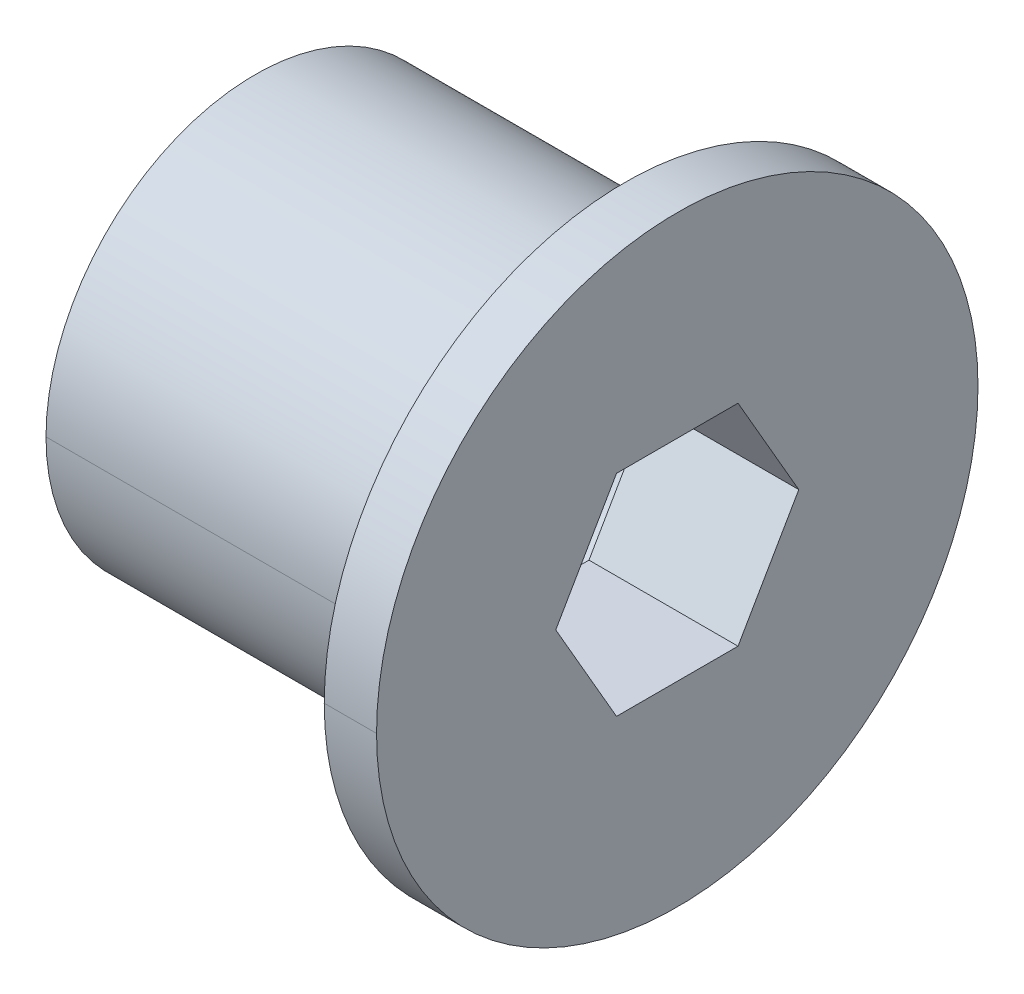
ISO-10303-21;
HEADER;
FILE_DESCRIPTION(('STEP AP214'),'2;1');
FILE_NAME('part.step','',(''),(''),'','','');
FILE_SCHEMA(('AUTOMOTIVE_DESIGN { 1 0 10303 214 1 1 1 1 }'));
ENDSEC;
DATA;
#1=APPLICATION_CONTEXT('core data for automotive mechanical design processes');
#2=APPLICATION_PROTOCOL_DEFINITION('international standard','automotive_design',2000,#1);
#3=PRODUCT_CONTEXT('',#1,'mechanical');
#4=PRODUCT('Part','Part','',(#3));
#5=PRODUCT_RELATED_PRODUCT_CATEGORY('part','',(#4));
#6=PRODUCT_DEFINITION_FORMATION('','',#4);
#7=PRODUCT_DEFINITION_CONTEXT('part definition',#1,'design');
#8=PRODUCT_DEFINITION('design','',#6,#7);
#9=PRODUCT_DEFINITION_SHAPE('','',#8);
#10=(LENGTH_UNIT() NAMED_UNIT(*) SI_UNIT(.MILLI.,.METRE.));
#11=(NAMED_UNIT(*) PLANE_ANGLE_UNIT() SI_UNIT($,.RADIAN.));
#12=(NAMED_UNIT(*) SI_UNIT($,.STERADIAN.) SOLID_ANGLE_UNIT());
#13=UNCERTAINTY_MEASURE_WITH_UNIT(LENGTH_MEASURE(1.E-05),#10,'distance_accuracy_value','');
#14=(GEOMETRIC_REPRESENTATION_CONTEXT(3) GLOBAL_UNCERTAINTY_ASSIGNED_CONTEXT((#13)) GLOBAL_UNIT_ASSIGNED_CONTEXT((#10,
#11,#12)) REPRESENTATION_CONTEXT('',''));
#15=CARTESIAN_POINT('',(0.,0.,0.));
#16=DIRECTION('',(0.,0.,1.));
#17=DIRECTION('',(1.,0.,0.));
#18=AXIS2_PLACEMENT_3D('',#15,#16,#17);
#19=CARTESIAN_POINT('',(16.589375,0.,0.));
#20=DIRECTION('',(1.,0.,0.));
#21=DIRECTION('',(0.,1.,0.));
#22=AXIS2_PLACEMENT_3D('',#19,#20,#21);
#23=PLANE('',#22);
#24=CARTESIAN_POINT('',(16.589375,0.,0.));
#25=DIRECTION('',(-1.,0.,0.));
#26=DIRECTION('',(0.,0.,-1.));
#27=AXIS2_PLACEMENT_3D('',#24,#25,#26);
#28=CIRCLE('',#27,12.7);
#29=CARTESIAN_POINT('',(16.589375,0.,12.7));
#30=VERTEX_POINT('',#29);
#31=CARTESIAN_POINT('',(16.589375,0.,-12.7));
#32=VERTEX_POINT('',#31);
#33=EDGE_CURVE('E204',#30,#32,#28,.T.);
#34=ORIENTED_EDGE('',*,*,#33,.F.);
#35=CARTESIAN_POINT('',(16.589375,0.,0.));
#36=DIRECTION('',(-1.,0.,0.));
#37=DIRECTION('',(0.,0.,-1.));
#38=AXIS2_PLACEMENT_3D('',#35,#36,#37);
#39=CIRCLE('',#38,12.7);
#40=EDGE_CURVE('E176',#32,#30,#39,.T.);
#41=ORIENTED_EDGE('',*,*,#40,.F.);
#42=EDGE_LOOP('',(#34,#41));
#43=FACE_BOUND('',#42,.T.);
#44=CARTESIAN_POINT('',(16.589375,0.,0.));
#45=DIRECTION('',(-1.,0.,0.));
#46=DIRECTION('',(0.,0.,-1.));
#47=AXIS2_PLACEMENT_3D('',#44,#45,#46);
#48=CIRCLE('',#47,18.25625);
#49=CARTESIAN_POINT('',(16.589375,0.,18.25625));
#50=VERTEX_POINT('',#49);
#51=CARTESIAN_POINT('',(16.589375,0.,-18.25625));
#52=VERTEX_POINT('',#51);
#53=EDGE_CURVE('E244',#50,#52,#48,.T.);
#54=ORIENTED_EDGE('',*,*,#53,.T.);
#55=CARTESIAN_POINT('',(16.589375,0.,0.));
#56=DIRECTION('',(-1.,0.,0.));
#57=DIRECTION('',(0.,0.,-1.));
#58=AXIS2_PLACEMENT_3D('',#55,#56,#57);
#59=CIRCLE('',#58,18.25625);
#60=EDGE_CURVE('E284',#52,#50,#59,.T.);
#61=ORIENTED_EDGE('',*,*,#60,.T.);
#62=EDGE_LOOP('',(#54,#61));
#63=FACE_BOUND('',#62,.T.);
#64=ADVANCED_FACE('F17',(#43,#63),#23,.F.);
#65=CARTESIAN_POINT('',(-5.857875,0.,0.));
#66=DIRECTION('',(1.,0.,0.));
#67=DIRECTION('',(0.,0.,-1.));
#68=AXIS2_PLACEMENT_3D('',#65,#66,#67);
#69=CYLINDRICAL_SURFACE('',#68,11.1125);
#70=DIRECTION('',(1.,0.,0.));
#71=VECTOR('',#70,1.);
#72=CARTESIAN_POINT('',(-5.857875,0.,11.1125));
#73=LINE('',#72,#71);
#74=CARTESIAN_POINT('',(-5.857875,0.,11.1125));
#75=VERTEX_POINT('',#74);
#76=CARTESIAN_POINT('',(-4.841875,0.,11.1125));
#77=VERTEX_POINT('',#76);
#78=EDGE_CURVE('E278',#75,#77,#73,.T.);
#79=ORIENTED_EDGE('',*,*,#78,.F.);
#80=CARTESIAN_POINT('',(-5.857875,0.,0.));
#81=DIRECTION('',(-1.,0.,0.));
#82=DIRECTION('',(0.,0.,1.));
#83=AXIS2_PLACEMENT_3D('',#80,#81,#82);
#84=CIRCLE('',#83,11.1125);
#85=CARTESIAN_POINT('',(-5.857875,0.,-11.1125));
#86=VERTEX_POINT('',#85);
#87=EDGE_CURVE('E11',#75,#86,#84,.T.);
#88=ORIENTED_EDGE('',*,*,#87,.T.);
#89=DIRECTION('',(1.,0.,0.));
#90=VECTOR('',#89,1.);
#91=CARTESIAN_POINT('',(-5.857875,0.,-11.1125));
#92=LINE('',#91,#90);
#93=CARTESIAN_POINT('',(-4.841875,0.,-11.1125));
#94=VERTEX_POINT('',#93);
#95=EDGE_CURVE('E265',#86,#94,#92,.T.);
#96=ORIENTED_EDGE('',*,*,#95,.T.);
#97=CARTESIAN_POINT('',(-4.841875,0.,0.));
#98=DIRECTION('',(-1.,0.,0.));
#99=DIRECTION('',(0.,0.,1.));
#100=AXIS2_PLACEMENT_3D('',#97,#98,#99);
#101=CIRCLE('',#100,11.1125);
#102=EDGE_CURVE('E28',#77,#94,#101,.T.);
#103=ORIENTED_EDGE('',*,*,#102,.F.);
#104=EDGE_LOOP('',(#79,#88,#96,#103));
#105=FACE_BOUND('',#104,.T.);
#106=ADVANCED_FACE('F464',(#105),#69,.F.);
#107=CARTESIAN_POINT('',(-5.857875,0.,0.));
#108=DIRECTION('',(-1.,0.,0.));
#109=DIRECTION('',(0.,0.,1.));
#110=AXIS2_PLACEMENT_3D('',#107,#108,#109);
#111=PLANE('',#110);
#112=CARTESIAN_POINT('',(-5.857875,0.,0.));
#113=DIRECTION('',(-1.,0.,0.));
#114=DIRECTION('',(0.,0.,1.));
#115=AXIS2_PLACEMENT_3D('',#112,#113,#114);
#116=CIRCLE('',#115,11.1125);
#117=EDGE_CURVE('E344',#86,#75,#116,.T.);
#118=ORIENTED_EDGE('',*,*,#117,.F.);
#119=ORIENTED_EDGE('',*,*,#87,.F.);
#120=EDGE_LOOP('',(#118,#119));
#121=FACE_BOUND('',#120,.T.);
#122=CARTESIAN_POINT('',(-5.857875,0.,0.));
#123=DIRECTION('',(-1.,0.,0.));
#124=DIRECTION('',(0.,0.,1.));
#125=AXIS2_PLACEMENT_3D('',#122,#123,#124);
#126=CIRCLE('',#125,12.7);
#127=CARTESIAN_POINT('',(-5.857875,0.,12.7));
#128=VERTEX_POINT('',#127);
#129=CARTESIAN_POINT('',(-5.857875,0.,-12.7));
#130=VERTEX_POINT('',#129);
#131=EDGE_CURVE('E373',#128,#130,#126,.T.);
#132=ORIENTED_EDGE('',*,*,#131,.T.);
#133=CARTESIAN_POINT('',(-5.857875,0.,0.));
#134=DIRECTION('',(-1.,0.,0.));
#135=DIRECTION('',(0.,0.,1.));
#136=AXIS2_PLACEMENT_3D('',#133,#134,#135);
#137=CIRCLE('',#136,12.7);
#138=EDGE_CURVE('E314',#130,#128,#137,.T.);
#139=ORIENTED_EDGE('',*,*,#138,.T.);
#140=EDGE_LOOP('',(#132,#139));
#141=FACE_BOUND('',#140,.T.);
#142=ADVANCED_FACE('F469',(#121,#141),#111,.T.);
#143=CARTESIAN_POINT('',(-4.841875,0.,0.));
#144=DIRECTION('',(-1.,0.,0.));
#145=DIRECTION('',(0.,0.,1.));
#146=AXIS2_PLACEMENT_3D('',#143,#144,#145);
#147=PLANE('',#146);
#148=CARTESIAN_POINT('',(-4.841875,0.,0.));
#149=DIRECTION('',(-1.,0.,0.));
#150=DIRECTION('',(0.,0.,1.));
#151=AXIS2_PLACEMENT_3D('',#148,#149,#150);
#152=CIRCLE('',#151,11.1125);
#153=EDGE_CURVE('E270',#94,#77,#152,.T.);
#154=ORIENTED_EDGE('',*,*,#153,.T.);
#155=ORIENTED_EDGE('',*,*,#102,.T.);
#156=EDGE_LOOP('',(#154,#155));
#157=FACE_BOUND('',#156,.T.);
#158=CARTESIAN_POINT('',(-4.841875,0.,0.));
#159=DIRECTION('',(-1.,0.,0.));
#160=DIRECTION('',(0.,0.,1.));
#161=AXIS2_PLACEMENT_3D('',#158,#159,#160);
#162=CIRCLE('',#161,11.8237);
#163=CARTESIAN_POINT('',(-4.841875,0.,-11.8237));
#164=VERTEX_POINT('',#163);
#165=CARTESIAN_POINT('',(-4.841875,0.,11.8237));
#166=VERTEX_POINT('',#165);
#167=EDGE_CURVE('E269',#164,#166,#162,.T.);
#168=ORIENTED_EDGE('',*,*,#167,.F.);
#169=CARTESIAN_POINT('',(-4.841875,0.,0.));
#170=DIRECTION('',(-1.,0.,0.));
#171=DIRECTION('',(0.,0.,1.));
#172=AXIS2_PLACEMENT_3D('',#169,#170,#171);
#173=CIRCLE('',#172,11.8237);
#174=EDGE_CURVE('E271',#166,#164,#173,.T.);
#175=ORIENTED_EDGE('',*,*,#174,.F.);
#176=EDGE_LOOP('',(#168,#175));
#177=FACE_BOUND('',#176,.T.);
#178=ADVANCED_FACE('F525',(#157,#177),#147,.F.);
#179=CARTESIAN_POINT('',(-4.841875,0.,0.));
#180=DIRECTION('',(1.,0.,0.));
#181=DIRECTION('',(0.,0.,-1.));
#182=AXIS2_PLACEMENT_3D('',#179,#180,#181);
#183=CYLINDRICAL_SURFACE('',#182,11.8237);
#184=DIRECTION('',(1.,0.,0.));
#185=VECTOR('',#184,1.);
#186=CARTESIAN_POINT('',(-4.841875,0.,11.8237));
#187=LINE('',#186,#185);
#188=CARTESIAN_POINT('',(-3.571875,0.,11.8237));
#189=VERTEX_POINT('',#188);
#190=EDGE_CURVE('E225',#166,#189,#187,.T.);
#191=ORIENTED_EDGE('',*,*,#190,.F.);
#192=ORIENTED_EDGE('',*,*,#174,.T.);
#193=DIRECTION('',(1.,0.,0.));
#194=VECTOR('',#193,1.);
#195=CARTESIAN_POINT('',(-4.841875,0.,-11.8237));
#196=LINE('',#195,#194);
#197=CARTESIAN_POINT('',(-3.571875,0.,-11.8237));
#198=VERTEX_POINT('',#197);
#199=EDGE_CURVE('E224',#164,#198,#196,.T.);
#200=ORIENTED_EDGE('',*,*,#199,.T.);
#201=CARTESIAN_POINT('',(-3.571875,0.,0.));
#202=DIRECTION('',(-1.,0.,0.));
#203=DIRECTION('',(0.,0.,1.));
#204=AXIS2_PLACEMENT_3D('',#201,#202,#203);
#205=CIRCLE('',#204,11.8237);
#206=EDGE_CURVE('E194',#189,#198,#205,.T.);
#207=ORIENTED_EDGE('',*,*,#206,.F.);
#208=EDGE_LOOP('',(#191,#192,#200,#207));
#209=FACE_BOUND('',#208,.T.);
#210=ADVANCED_FACE('F520',(#209),#183,.F.);
#211=CARTESIAN_POINT('',(19.764375,-6.3881,3.68817125461024));
#212=DIRECTION('',(0.,1.,0.));
#213=DIRECTION('',(0.,0.,-1.));
#214=AXIS2_PLACEMENT_3D('',#211,#212,#213);
#215=PLANE('',#214);
#216=DIRECTION('',(0.,0.,-1.));
#217=VECTOR('',#216,1.);
#218=CARTESIAN_POINT('',(10.715625,-6.3881,3.68817125461024));
#219=LINE('',#218,#217);
#220=CARTESIAN_POINT('',(10.715625,-6.3881,3.68817125461024));
#221=VERTEX_POINT('',#220);
#222=CARTESIAN_POINT('',(10.715625,-6.3881,-3.68817125461025));
#223=VERTEX_POINT('',#222);
#224=EDGE_CURVE('E305',#221,#223,#219,.T.);
#225=ORIENTED_EDGE('',*,*,#224,.F.);
#226=DIRECTION('',(-1.,0.,0.));
#227=VECTOR('',#226,1.);
#228=CARTESIAN_POINT('',(19.764375,-6.3881,3.68817125461024));
#229=LINE('',#228,#227);
#230=CARTESIAN_POINT('',(19.764375,-6.3881,3.68817125461024));
#231=VERTEX_POINT('',#230);
#232=EDGE_CURVE('E274',#231,#221,#229,.T.);
#233=ORIENTED_EDGE('',*,*,#232,.F.);
#234=DIRECTION('',(0.,0.,-1.));
#235=VECTOR('',#234,1.);
#236=CARTESIAN_POINT('',(19.764375,-6.3881,3.68817125461024));
#237=LINE('',#236,#235);
#238=CARTESIAN_POINT('',(19.764375,-6.3881,-3.68817125461025));
#239=VERTEX_POINT('',#238);
#240=EDGE_CURVE('E329',#231,#239,#237,.T.);
#241=ORIENTED_EDGE('',*,*,#240,.T.);
#242=DIRECTION('',(-1.,0.,0.));
#243=VECTOR('',#242,1.);
#244=CARTESIAN_POINT('',(19.764375,-6.3881,-3.68817125461025));
#245=LINE('',#244,#243);
#246=EDGE_CURVE('E163',#239,#223,#245,.T.);
#247=ORIENTED_EDGE('',*,*,#246,.T.);
#248=EDGE_LOOP('',(#225,#233,#241,#247));
#249=FACE_BOUND('',#248,.T.);
#250=ADVANCED_FACE('F19',(#249),#215,.T.);
#251=CARTESIAN_POINT('',(19.764375,0.,7.37634250922049));
#252=DIRECTION('',(0.,0.5,-0.866025403784439));
#253=DIRECTION('',(-1.,0.,0.));
#254=AXIS2_PLACEMENT_3D('',#251,#252,#253);
#255=PLANE('',#254);
#256=DIRECTION('',(0.,-0.866025403784439,-0.5));
#257=VECTOR('',#256,1.);
#258=CARTESIAN_POINT('',(10.715625,0.,7.37634250922049));
#259=LINE('',#258,#257);
#260=CARTESIAN_POINT('',(10.715625,0.,7.37634250922049));
#261=VERTEX_POINT('',#260);
#262=EDGE_CURVE('E21',#261,#221,#259,.T.);
#263=ORIENTED_EDGE('',*,*,#262,.F.);
#264=DIRECTION('',(-1.,0.,0.));
#265=VECTOR('',#264,1.);
#266=CARTESIAN_POINT('',(19.764375,0.,7.37634250922049));
#267=LINE('',#266,#265);
#268=CARTESIAN_POINT('',(19.764375,0.,7.37634250922049));
#269=VERTEX_POINT('',#268);
#270=EDGE_CURVE('E291',#269,#261,#267,.T.);
#271=ORIENTED_EDGE('',*,*,#270,.F.);
#272=DIRECTION('',(0.,-0.866025403784439,-0.5));
#273=VECTOR('',#272,1.);
#274=CARTESIAN_POINT('',(19.764375,0.,7.37634250922049));
#275=LINE('',#274,#273);
#276=EDGE_CURVE('E230',#269,#231,#275,.T.);
#277=ORIENTED_EDGE('',*,*,#276,.T.);
#278=ORIENTED_EDGE('',*,*,#232,.T.);
#279=EDGE_LOOP('',(#263,#271,#277,#278));
#280=FACE_BOUND('',#279,.T.);
#281=ADVANCED_FACE('F635',(#280),#255,.T.);
#282=CARTESIAN_POINT('',(19.764375,6.3881,3.68817125461025));
#283=DIRECTION('',(0.,-0.5,-0.866025403784439));
#284=DIRECTION('',(0.,-0.866025403784439,0.5));
#285=AXIS2_PLACEMENT_3D('',#282,#283,#284);
#286=PLANE('',#285);
#287=DIRECTION('',(0.,-0.866025403784439,0.5));
#288=VECTOR('',#287,1.);
#289=CARTESIAN_POINT('',(10.715625,6.3881,3.68817125461025));
#290=LINE('',#289,#288);
#291=CARTESIAN_POINT('',(10.715625,6.3881,3.68817125461025));
#292=VERTEX_POINT('',#291);
#293=EDGE_CURVE('E295',#292,#261,#290,.T.);
#294=ORIENTED_EDGE('',*,*,#293,.F.);
#295=DIRECTION('',(-1.,0.,0.));
#296=VECTOR('',#295,1.);
#297=CARTESIAN_POINT('',(19.764375,6.3881,3.68817125461025));
#298=LINE('',#297,#296);
#299=CARTESIAN_POINT('',(19.764375,6.3881,3.68817125461025));
#300=VERTEX_POINT('',#299);
#301=EDGE_CURVE('E42',#300,#292,#298,.T.);
#302=ORIENTED_EDGE('',*,*,#301,.F.);
#303=DIRECTION('',(0.,-0.866025403784439,0.5));
#304=VECTOR('',#303,1.);
#305=CARTESIAN_POINT('',(19.764375,6.3881,3.68817125461025));
#306=LINE('',#305,#304);
#307=EDGE_CURVE('E226',#300,#269,#306,.T.);
#308=ORIENTED_EDGE('',*,*,#307,.T.);
#309=ORIENTED_EDGE('',*,*,#270,.T.);
#310=EDGE_LOOP('',(#294,#302,#308,#309));
#311=FACE_BOUND('',#310,.T.);
#312=ADVANCED_FACE('F627',(#311),#286,.T.);
#313=CARTESIAN_POINT('',(19.764375,6.3881,-3.68817125461025));
#314=DIRECTION('',(0.,-1.,0.));
#315=DIRECTION('',(0.,0.,-1.));
#316=AXIS2_PLACEMENT_3D('',#313,#314,#315);
#317=PLANE('',#316);
#318=DIRECTION('',(0.,0.,1.));
#319=VECTOR('',#318,1.);
#320=CARTESIAN_POINT('',(10.715625,6.3881,-3.68817125461025));
#321=LINE('',#320,#319);
#322=CARTESIAN_POINT('',(10.715625,6.3881,-3.68817125461025));
#323=VERTEX_POINT('',#322);
#324=EDGE_CURVE('E263',#323,#292,#321,.T.);
#325=ORIENTED_EDGE('',*,*,#324,.F.);
#326=DIRECTION('',(-1.,0.,0.));
#327=VECTOR('',#326,1.);
#328=CARTESIAN_POINT('',(19.764375,6.3881,-3.68817125461025));
#329=LINE('',#328,#327);
#330=CARTESIAN_POINT('',(19.764375,6.3881,-3.68817125461025));
#331=VERTEX_POINT('',#330);
#332=EDGE_CURVE('E341',#331,#323,#329,.T.);
#333=ORIENTED_EDGE('',*,*,#332,.F.);
#334=DIRECTION('',(0.,0.,1.));
#335=VECTOR('',#334,1.);
#336=CARTESIAN_POINT('',(19.764375,6.3881,-3.68817125461025));
#337=LINE('',#336,#335);
#338=EDGE_CURVE('E229',#331,#300,#337,.T.);
#339=ORIENTED_EDGE('',*,*,#338,.T.);
#340=ORIENTED_EDGE('',*,*,#301,.T.);
#341=EDGE_LOOP('',(#325,#333,#339,#340));
#342=FACE_BOUND('',#341,.T.);
#343=ADVANCED_FACE('F497',(#342),#317,.T.);
#344=CARTESIAN_POINT('',(19.764375,0.,-7.3763425092205));
#345=DIRECTION('',(0.,-0.5,0.866025403784439));
#346=DIRECTION('',(-1.,0.,0.));
#347=AXIS2_PLACEMENT_3D('',#344,#345,#346);
#348=PLANE('',#347);
#349=DIRECTION('',(0.,0.866025403784439,0.5));
#350=VECTOR('',#349,1.);
#351=CARTESIAN_POINT('',(10.715625,0.,-7.3763425092205));
#352=LINE('',#351,#350);
#353=CARTESIAN_POINT('',(10.715625,0.,-7.3763425092205));
#354=VERTEX_POINT('',#353);
#355=EDGE_CURVE('E259',#354,#323,#352,.T.);
#356=ORIENTED_EDGE('',*,*,#355,.F.);
#357=DIRECTION('',(-1.,0.,0.));
#358=VECTOR('',#357,1.);
#359=CARTESIAN_POINT('',(19.764375,0.,-7.3763425092205));
#360=LINE('',#359,#358);
#361=CARTESIAN_POINT('',(19.764375,0.,-7.3763425092205));
#362=VERTEX_POINT('',#361);
#363=EDGE_CURVE('E149',#362,#354,#360,.T.);
#364=ORIENTED_EDGE('',*,*,#363,.F.);
#365=DIRECTION('',(0.,0.866025403784439,0.5));
#366=VECTOR('',#365,1.);
#367=CARTESIAN_POINT('',(19.764375,0.,-7.3763425092205));
#368=LINE('',#367,#366);
#369=EDGE_CURVE('E350',#362,#331,#368,.T.);
#370=ORIENTED_EDGE('',*,*,#369,.T.);
#371=ORIENTED_EDGE('',*,*,#332,.T.);
#372=EDGE_LOOP('',(#356,#364,#370,#371));
#373=FACE_BOUND('',#372,.T.);
#374=ADVANCED_FACE('F491',(#373),#348,.T.);
#375=CARTESIAN_POINT('',(19.764375,-6.3881,-3.68817125461025));
#376=DIRECTION('',(0.,0.5,0.866025403784439));
#377=DIRECTION('',(1.,0.,0.));
#378=AXIS2_PLACEMENT_3D('',#375,#376,#377);
#379=PLANE('',#378);
#380=DIRECTION('',(0.,0.866025403784439,-0.5));
#381=VECTOR('',#380,1.);
#382=CARTESIAN_POINT('',(10.715625,-6.3881,-3.68817125461025));
#383=LINE('',#382,#381);
#384=EDGE_CURVE('E264',#223,#354,#383,.T.);
#385=ORIENTED_EDGE('',*,*,#384,.F.);
#386=ORIENTED_EDGE('',*,*,#246,.F.);
#387=DIRECTION('',(0.,0.866025403784439,-0.5));
#388=VECTOR('',#387,1.);
#389=CARTESIAN_POINT('',(19.764375,-6.3881,-3.68817125461025));
#390=LINE('',#389,#388);
#391=EDGE_CURVE('E348',#239,#362,#390,.T.);
#392=ORIENTED_EDGE('',*,*,#391,.T.);
#393=ORIENTED_EDGE('',*,*,#363,.T.);
#394=EDGE_LOOP('',(#385,#386,#392,#393));
#395=FACE_BOUND('',#394,.T.);
#396=ADVANCED_FACE('F496',(#395),#379,.T.);
#397=CARTESIAN_POINT('',(19.764375,0.,0.));
#398=DIRECTION('',(-1.,0.,0.));
#399=DIRECTION('',(0.,0.,1.));
#400=AXIS2_PLACEMENT_3D('',#397,#398,#399);
#401=CYLINDRICAL_SURFACE('',#400,18.25625);
#402=DIRECTION('',(-1.,0.,0.));
#403=VECTOR('',#402,1.);
#404=CARTESIAN_POINT('',(19.764375,0.,-18.25625));
#405=LINE('',#404,#403);
#406=CARTESIAN_POINT('',(19.764375,0.,-18.25625));
#407=VERTEX_POINT('',#406);
#408=EDGE_CURVE('E237',#407,#52,#405,.T.);
#409=ORIENTED_EDGE('',*,*,#408,.F.);
#410=CARTESIAN_POINT('',(19.764375,0.,0.));
#411=DIRECTION('',(1.,0.,0.));
#412=DIRECTION('',(0.,0.,-1.));
#413=AXIS2_PLACEMENT_3D('',#410,#411,#412);
#414=CIRCLE('',#413,18.25625);
#415=CARTESIAN_POINT('',(19.764375,0.,18.25625));
#416=VERTEX_POINT('',#415);
#417=EDGE_CURVE('E127',#416,#407,#414,.T.);
#418=ORIENTED_EDGE('',*,*,#417,.F.);
#419=DIRECTION('',(-1.,0.,0.));
#420=VECTOR('',#419,1.);
#421=CARTESIAN_POINT('',(19.764375,0.,18.25625));
#422=LINE('',#421,#420);
#423=EDGE_CURVE('E279',#416,#50,#422,.T.);
#424=ORIENTED_EDGE('',*,*,#423,.T.);
#425=ORIENTED_EDGE('',*,*,#60,.F.);
#426=EDGE_LOOP('',(#409,#418,#424,#425));
#427=FACE_BOUND('',#426,.T.);
#428=ADVANCED_FACE('F675',(#427),#401,.T.);
#429=CARTESIAN_POINT('',(19.764375,0.,0.));
#430=DIRECTION('',(1.,0.,0.));
#431=DIRECTION('',(0.,1.,0.));
#432=AXIS2_PLACEMENT_3D('',#429,#430,#431);
#433=PLANE('',#432);
#434=ORIENTED_EDGE('',*,*,#369,.F.);
#435=ORIENTED_EDGE('',*,*,#391,.F.);
#436=ORIENTED_EDGE('',*,*,#240,.F.);
#437=ORIENTED_EDGE('',*,*,#276,.F.);
#438=ORIENTED_EDGE('',*,*,#307,.F.);
#439=ORIENTED_EDGE('',*,*,#338,.F.);
#440=EDGE_LOOP('',(#434,#435,#436,#437,#438,#439));
#441=FACE_BOUND('',#440,.T.);
#442=ORIENTED_EDGE('',*,*,#417,.T.);
#443=CARTESIAN_POINT('',(19.764375,0.,0.));
#444=DIRECTION('',(1.,0.,0.));
#445=DIRECTION('',(0.,0.,-1.));
#446=AXIS2_PLACEMENT_3D('',#443,#444,#445);
#447=CIRCLE('',#446,18.25625);
#448=EDGE_CURVE('E235',#407,#416,#447,.T.);
#449=ORIENTED_EDGE('',*,*,#448,.T.);
#450=EDGE_LOOP('',(#442,#449));
#451=FACE_BOUND('',#450,.T.);
#452=ADVANCED_FACE('F589',(#441,#451),#433,.T.);
#453=CARTESIAN_POINT('',(10.715625,0.,0.));
#454=DIRECTION('',(1.,0.,0.));
#455=DIRECTION('',(0.,1.,0.));
#456=AXIS2_PLACEMENT_3D('',#453,#454,#455);
#457=PLANE('',#456);
#458=ORIENTED_EDGE('',*,*,#384,.T.);
#459=ORIENTED_EDGE('',*,*,#355,.T.);
#460=ORIENTED_EDGE('',*,*,#324,.T.);
#461=ORIENTED_EDGE('',*,*,#293,.T.);
#462=ORIENTED_EDGE('',*,*,#262,.T.);
#463=ORIENTED_EDGE('',*,*,#224,.T.);
#464=EDGE_LOOP('',(#458,#459,#460,#461,#462,#463));
#465=FACE_BOUND('',#464,.T.);
#466=CARTESIAN_POINT('',(10.715625,0.,0.));
#467=DIRECTION('',(1.,0.,0.));
#468=DIRECTION('',(0.,0.,-1.));
#469=AXIS2_PLACEMENT_3D('',#466,#467,#468);
#470=CIRCLE('',#469,9.525);
#471=CARTESIAN_POINT('',(10.715625,0.,9.525));
#472=VERTEX_POINT('',#471);
#473=CARTESIAN_POINT('',(10.715625,0.,-9.525));
#474=VERTEX_POINT('',#473);
#475=EDGE_CURVE('E282',#472,#474,#470,.T.);
#476=ORIENTED_EDGE('',*,*,#475,.F.);
#477=CARTESIAN_POINT('',(10.715625,0.,0.));
#478=DIRECTION('',(1.,0.,0.));
#479=DIRECTION('',(0.,0.,-1.));
#480=AXIS2_PLACEMENT_3D('',#477,#478,#479);
#481=CIRCLE('',#480,9.525);
#482=EDGE_CURVE('E234',#474,#472,#481,.T.);
#483=ORIENTED_EDGE('',*,*,#482,.F.);
#484=EDGE_LOOP('',(#476,#483));
#485=FACE_BOUND('',#484,.T.);
#486=ADVANCED_FACE('F584',(#465,#485),#457,.F.);
#487=CARTESIAN_POINT('',(10.715625,0.,0.));
#488=DIRECTION('',(-1.,0.,0.));
#489=DIRECTION('',(0.,0.,1.));
#490=AXIS2_PLACEMENT_3D('',#487,#488,#489);
#491=CYLINDRICAL_SURFACE('',#490,9.525);
#492=DIRECTION('',(-1.,0.,0.));
#493=VECTOR('',#492,1.);
#494=CARTESIAN_POINT('',(10.715625,0.,-9.525));
#495=LINE('',#494,#493);
#496=CARTESIAN_POINT('',(3.571875,0.,-9.525));
#497=VERTEX_POINT('',#496);
#498=EDGE_CURVE('E312',#474,#497,#495,.T.);
#499=ORIENTED_EDGE('',*,*,#498,.F.);
#500=ORIENTED_EDGE('',*,*,#482,.T.);
#501=DIRECTION('',(-1.,0.,0.));
#502=VECTOR('',#501,1.);
#503=CARTESIAN_POINT('',(10.715625,0.,9.525));
#504=LINE('',#503,#502);
#505=CARTESIAN_POINT('',(3.571875,0.,9.525));
#506=VERTEX_POINT('',#505);
#507=EDGE_CURVE('E258',#472,#506,#504,.T.);
#508=ORIENTED_EDGE('',*,*,#507,.T.);
#509=CARTESIAN_POINT('',(3.571875,0.,0.));
#510=DIRECTION('',(1.,0.,0.));
#511=DIRECTION('',(0.,0.,-1.));
#512=AXIS2_PLACEMENT_3D('',#509,#510,#511);
#513=CIRCLE('',#512,9.525);
#514=EDGE_CURVE('E231',#497,#506,#513,.T.);
#515=ORIENTED_EDGE('',*,*,#514,.F.);
#516=EDGE_LOOP('',(#499,#500,#508,#515));
#517=FACE_BOUND('',#516,.T.);
#518=ADVANCED_FACE('F511',(#517),#491,.F.);
#519=CARTESIAN_POINT('',(3.571875,0.,0.));
#520=DIRECTION('',(1.,0.,0.));
#521=DIRECTION('',(0.,1.,0.));
#522=AXIS2_PLACEMENT_3D('',#519,#520,#521);
#523=PLANE('',#522);
#524=CARTESIAN_POINT('',(3.571875,0.,0.));
#525=DIRECTION('',(1.,0.,0.));
#526=DIRECTION('',(0.,0.,-1.));
#527=AXIS2_PLACEMENT_3D('',#524,#525,#526);
#528=CIRCLE('',#527,9.525);
#529=EDGE_CURVE('E218',#506,#497,#528,.T.);
#530=ORIENTED_EDGE('',*,*,#529,.T.);
#531=ORIENTED_EDGE('',*,*,#514,.T.);
#532=EDGE_LOOP('',(#530,#531));
#533=FACE_BOUND('',#532,.T.);
#534=CARTESIAN_POINT('',(3.571875,0.,0.));
#535=DIRECTION('',(1.,0.,0.));
#536=DIRECTION('',(0.,0.,-1.));
#537=AXIS2_PLACEMENT_3D('',#534,#535,#536);
#538=CIRCLE('',#537,11.1125);
#539=CARTESIAN_POINT('',(3.571875,0.,11.1125));
#540=VERTEX_POINT('',#539);
#541=CARTESIAN_POINT('',(3.571875,0.,-11.1125));
#542=VERTEX_POINT('',#541);
#543=EDGE_CURVE('E214',#540,#542,#538,.T.);
#544=ORIENTED_EDGE('',*,*,#543,.F.);
#545=CARTESIAN_POINT('',(3.571875,0.,0.));
#546=DIRECTION('',(1.,0.,0.));
#547=DIRECTION('',(0.,0.,-1.));
#548=AXIS2_PLACEMENT_3D('',#545,#546,#547);
#549=CIRCLE('',#548,11.1125);
#550=EDGE_CURVE('E199',#542,#540,#549,.T.);
#551=ORIENTED_EDGE('',*,*,#550,.F.);
#552=EDGE_LOOP('',(#544,#551));
#553=FACE_BOUND('',#552,.T.);
#554=ADVANCED_FACE('F506',(#533,#553),#523,.F.);
#555=CARTESIAN_POINT('',(3.571875,0.,0.));
#556=DIRECTION('',(-1.,0.,0.));
#557=DIRECTION('',(0.,0.,1.));
#558=AXIS2_PLACEMENT_3D('',#555,#556,#557);
#559=CYLINDRICAL_SURFACE('',#558,11.1125);
#560=DIRECTION('',(-1.,0.,0.));
#561=VECTOR('',#560,1.);
#562=CARTESIAN_POINT('',(3.571875,0.,-11.1125));
#563=LINE('',#562,#561);
#564=CARTESIAN_POINT('',(-3.571875,0.,-11.1125));
#565=VERTEX_POINT('',#564);
#566=EDGE_CURVE('E207',#542,#565,#563,.T.);
#567=ORIENTED_EDGE('',*,*,#566,.F.);
#568=ORIENTED_EDGE('',*,*,#550,.T.);
#569=DIRECTION('',(-1.,0.,0.));
#570=VECTOR('',#569,1.);
#571=CARTESIAN_POINT('',(3.571875,0.,11.1125));
#572=LINE('',#571,#570);
#573=CARTESIAN_POINT('',(-3.571875,0.,11.1125));
#574=VERTEX_POINT('',#573);
#575=EDGE_CURVE('E197',#540,#574,#572,.T.);
#576=ORIENTED_EDGE('',*,*,#575,.T.);
#577=CARTESIAN_POINT('',(-3.571875,0.,0.));
#578=DIRECTION('',(1.,0.,0.));
#579=DIRECTION('',(0.,0.,-1.));
#580=AXIS2_PLACEMENT_3D('',#577,#578,#579);
#581=CIRCLE('',#580,11.1125);
#582=EDGE_CURVE('E184',#565,#574,#581,.T.);
#583=ORIENTED_EDGE('',*,*,#582,.F.);
#584=EDGE_LOOP('',(#567,#568,#576,#583));
#585=FACE_BOUND('',#584,.T.);
#586=ADVANCED_FACE('F198',(#585),#559,.F.);
#587=CARTESIAN_POINT('',(3.571875,0.,0.));
#588=DIRECTION('',(-1.,0.,0.));
#589=DIRECTION('',(0.,0.,1.));
#590=AXIS2_PLACEMENT_3D('',#587,#588,#589);
#591=CYLINDRICAL_SURFACE('',#590,12.7);
#592=DIRECTION('',(-1.,0.,0.));
#593=VECTOR('',#592,1.);
#594=CARTESIAN_POINT('',(3.571875,0.,-12.7));
#595=LINE('',#594,#593);
#596=EDGE_CURVE('E294',#32,#130,#595,.T.);
#597=ORIENTED_EDGE('',*,*,#596,.F.);
#598=ORIENTED_EDGE('',*,*,#40,.T.);
#599=DIRECTION('',(-1.,0.,0.));
#600=VECTOR('',#599,1.);
#601=CARTESIAN_POINT('',(3.571875,0.,12.7));
#602=LINE('',#601,#600);
#603=EDGE_CURVE('E338',#30,#128,#602,.T.);
#604=ORIENTED_EDGE('',*,*,#603,.T.);
#605=ORIENTED_EDGE('',*,*,#138,.F.);
#606=EDGE_LOOP('',(#597,#598,#604,#605));
#607=FACE_BOUND('',#606,.T.);
#608=ADVANCED_FACE('F577',(#607),#591,.T.);
#609=CARTESIAN_POINT('',(-3.571875,0.,0.));
#610=DIRECTION('',(1.,0.,0.));
#611=DIRECTION('',(0.,1.,0.));
#612=AXIS2_PLACEMENT_3D('',#609,#610,#611);
#613=PLANE('',#612);
#614=CARTESIAN_POINT('',(-3.571875,0.,0.));
#615=DIRECTION('',(1.,0.,0.));
#616=DIRECTION('',(0.,0.,-1.));
#617=AXIS2_PLACEMENT_3D('',#614,#615,#616);
#618=CIRCLE('',#617,11.1125);
#619=EDGE_CURVE('E189',#574,#565,#618,.T.);
#620=ORIENTED_EDGE('',*,*,#619,.T.);
#621=ORIENTED_EDGE('',*,*,#582,.T.);
#622=EDGE_LOOP('',(#620,#621));
#623=FACE_BOUND('',#622,.T.);
#624=CARTESIAN_POINT('',(-3.571875,0.,0.));
#625=DIRECTION('',(-1.,0.,0.));
#626=DIRECTION('',(0.,0.,1.));
#627=AXIS2_PLACEMENT_3D('',#624,#625,#626);
#628=CIRCLE('',#627,11.8237);
#629=EDGE_CURVE('E220',#198,#189,#628,.T.);
#630=ORIENTED_EDGE('',*,*,#629,.T.);
#631=ORIENTED_EDGE('',*,*,#206,.T.);
#632=EDGE_LOOP('',(#630,#631));
#633=FACE_BOUND('',#632,.T.);
#634=ADVANCED_FACE('F186',(#623,#633),#613,.F.);
#635=CARTESIAN_POINT('',(3.571875,0.,0.));
#636=DIRECTION('',(-1.,0.,0.));
#637=DIRECTION('',(0.,0.,1.));
#638=AXIS2_PLACEMENT_3D('',#635,#636,#637);
#639=CYLINDRICAL_SURFACE('',#638,12.7);
#640=ORIENTED_EDGE('',*,*,#33,.T.);
#641=ORIENTED_EDGE('',*,*,#596,.T.);
#642=ORIENTED_EDGE('',*,*,#131,.F.);
#643=ORIENTED_EDGE('',*,*,#603,.F.);
#644=EDGE_LOOP('',(#640,#641,#642,#643));
#645=FACE_BOUND('',#644,.T.);
#646=ADVANCED_FACE('F478',(#645),#639,.T.);
#647=CARTESIAN_POINT('',(3.571875,0.,0.));
#648=DIRECTION('',(-1.,0.,0.));
#649=DIRECTION('',(0.,0.,1.));
#650=AXIS2_PLACEMENT_3D('',#647,#648,#649);
#651=CYLINDRICAL_SURFACE('',#650,11.1125);
#652=ORIENTED_EDGE('',*,*,#543,.T.);
#653=ORIENTED_EDGE('',*,*,#566,.T.);
#654=ORIENTED_EDGE('',*,*,#619,.F.);
#655=ORIENTED_EDGE('',*,*,#575,.F.);
#656=EDGE_LOOP('',(#652,#653,#654,#655));
#657=FACE_BOUND('',#656,.T.);
#658=ADVANCED_FACE('F206',(#657),#651,.F.);
#659=CARTESIAN_POINT('',(10.715625,0.,0.));
#660=DIRECTION('',(-1.,0.,0.));
#661=DIRECTION('',(0.,0.,1.));
#662=AXIS2_PLACEMENT_3D('',#659,#660,#661);
#663=CYLINDRICAL_SURFACE('',#662,9.525);
#664=ORIENTED_EDGE('',*,*,#475,.T.);
#665=ORIENTED_EDGE('',*,*,#498,.T.);
#666=ORIENTED_EDGE('',*,*,#529,.F.);
#667=ORIENTED_EDGE('',*,*,#507,.F.);
#668=EDGE_LOOP('',(#664,#665,#666,#667));
#669=FACE_BOUND('',#668,.T.);
#670=ADVANCED_FACE('F567',(#669),#663,.F.);
#671=CARTESIAN_POINT('',(19.764375,0.,0.));
#672=DIRECTION('',(-1.,0.,0.));
#673=DIRECTION('',(0.,0.,1.));
#674=AXIS2_PLACEMENT_3D('',#671,#672,#673);
#675=CYLINDRICAL_SURFACE('',#674,18.25625);
#676=ORIENTED_EDGE('',*,*,#448,.F.);
#677=ORIENTED_EDGE('',*,*,#408,.T.);
#678=ORIENTED_EDGE('',*,*,#53,.F.);
#679=ORIENTED_EDGE('',*,*,#423,.F.);
#680=EDGE_LOOP('',(#676,#677,#678,#679));
#681=FACE_BOUND('',#680,.T.);
#682=ADVANCED_FACE('F599',(#681),#675,.T.);
#683=CARTESIAN_POINT('',(-4.841875,0.,0.));
#684=DIRECTION('',(1.,0.,0.));
#685=DIRECTION('',(0.,0.,-1.));
#686=AXIS2_PLACEMENT_3D('',#683,#684,#685);
#687=CYLINDRICAL_SURFACE('',#686,11.8237);
#688=ORIENTED_EDGE('',*,*,#167,.T.);
#689=ORIENTED_EDGE('',*,*,#190,.T.);
#690=ORIENTED_EDGE('',*,*,#629,.F.);
#691=ORIENTED_EDGE('',*,*,#199,.F.);
#692=EDGE_LOOP('',(#688,#689,#690,#691));
#693=FACE_BOUND('',#692,.T.);
#694=ADVANCED_FACE('F556',(#693),#687,.F.);
#695=CARTESIAN_POINT('',(-5.857875,0.,0.));
#696=DIRECTION('',(1.,0.,0.));
#697=DIRECTION('',(0.,0.,-1.));
#698=AXIS2_PLACEMENT_3D('',#695,#696,#697);
#699=CYLINDRICAL_SURFACE('',#698,11.1125);
#700=ORIENTED_EDGE('',*,*,#117,.T.);
#701=ORIENTED_EDGE('',*,*,#78,.T.);
#702=ORIENTED_EDGE('',*,*,#153,.F.);
#703=ORIENTED_EDGE('',*,*,#95,.F.);
#704=EDGE_LOOP('',(#700,#701,#702,#703));
#705=FACE_BOUND('',#704,.T.);
#706=ADVANCED_FACE('F551',(#705),#699,.F.);
#707=CLOSED_SHELL('',(#64,#106,#142,#178,#210,#250,#281,#312,#343,#374,#396,#428,#452,#486,#518,
#554,#586,#608,#634,#646,#658,#670,#682,#694,#706));
#708=MANIFOLD_SOLID_BREP('B1',#707);
#709=ADVANCED_BREP_SHAPE_REPRESENTATION('',(#18,#708),#14);
#710=SHAPE_DEFINITION_REPRESENTATION(#9,#709);
ENDSEC;
END-ISO-10303-21;
